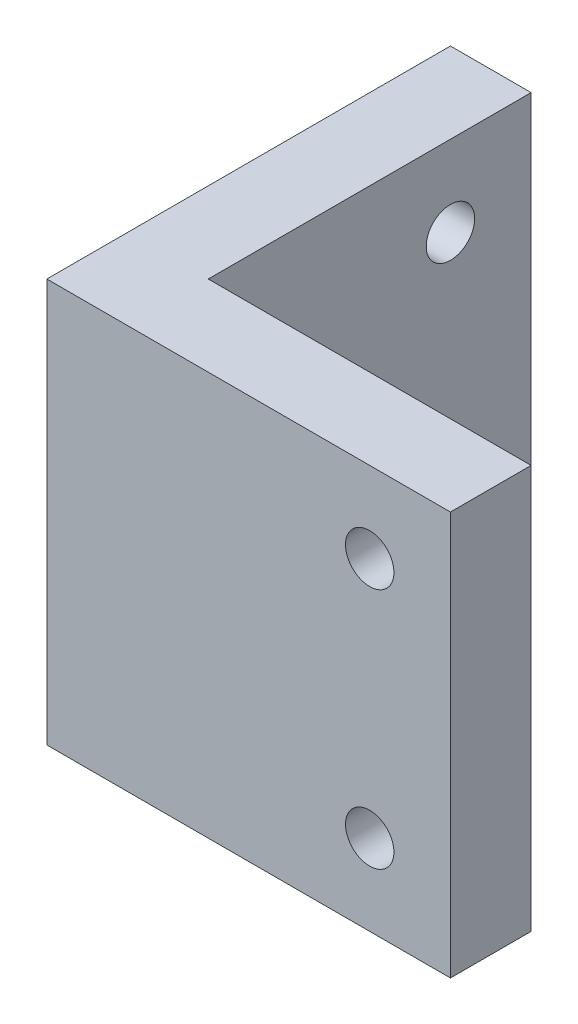
ISO-10303-21;
HEADER;
FILE_DESCRIPTION(('STEP AP214'),'2;1');
FILE_NAME('part.step','',(''),(''),'','','');
FILE_SCHEMA(('AUTOMOTIVE_DESIGN { 1 0 10303 214 1 1 1 1 }'));
ENDSEC;
DATA;
#1=APPLICATION_CONTEXT('core data for automotive mechanical design processes');
#2=APPLICATION_PROTOCOL_DEFINITION('international standard','automotive_design',2000,#1);
#3=PRODUCT_CONTEXT('',#1,'mechanical');
#4=PRODUCT('Part','Part','',(#3));
#5=PRODUCT_RELATED_PRODUCT_CATEGORY('part','',(#4));
#6=PRODUCT_DEFINITION_FORMATION('','',#4);
#7=PRODUCT_DEFINITION_CONTEXT('part definition',#1,'design');
#8=PRODUCT_DEFINITION('design','',#6,#7);
#9=PRODUCT_DEFINITION_SHAPE('','',#8);
#10=(LENGTH_UNIT() NAMED_UNIT(*) SI_UNIT(.MILLI.,.METRE.));
#11=(NAMED_UNIT(*) PLANE_ANGLE_UNIT() SI_UNIT($,.RADIAN.));
#12=(NAMED_UNIT(*) SI_UNIT($,.STERADIAN.) SOLID_ANGLE_UNIT());
#13=UNCERTAINTY_MEASURE_WITH_UNIT(LENGTH_MEASURE(1.E-05),#10,'distance_accuracy_value','');
#14=(GEOMETRIC_REPRESENTATION_CONTEXT(3) GLOBAL_UNCERTAINTY_ASSIGNED_CONTEXT((#13)) GLOBAL_UNIT_ASSIGNED_CONTEXT((#10,
#11,#12)) REPRESENTATION_CONTEXT('',''));
#15=CARTESIAN_POINT('',(0.,0.,0.));
#16=DIRECTION('',(0.,0.,1.));
#17=DIRECTION('',(1.,0.,0.));
#18=AXIS2_PLACEMENT_3D('',#15,#16,#17);
#19=CARTESIAN_POINT('',(25.,25.,-5.));
#20=DIRECTION('',(0.,0.,1.));
#21=DIRECTION('',(1.,0.,0.));
#22=AXIS2_PLACEMENT_3D('',#19,#20,#21);
#23=PLANE('',#22);
#24=CARTESIAN_POINT('',(20.,20.,-5.));
#25=DIRECTION('',(0.,0.,-1.));
#26=DIRECTION('',(-1.,0.,0.));
#27=AXIS2_PLACEMENT_3D('',#24,#25,#26);
#28=CIRCLE('',#27,1.5);
#29=CARTESIAN_POINT('',(18.5,20.,-5.));
#30=VERTEX_POINT('',#29);
#31=EDGE_CURVE('E138',#30,#30,#28,.T.);
#32=ORIENTED_EDGE('',*,*,#31,.F.);
#33=EDGE_LOOP('',(#32));
#34=FACE_BOUND('',#33,.T.);
#35=CARTESIAN_POINT('',(20.,5.,-5.));
#36=DIRECTION('',(0.,0.,-1.));
#37=DIRECTION('',(-1.,0.,0.));
#38=AXIS2_PLACEMENT_3D('',#35,#36,#37);
#39=CIRCLE('',#38,1.5);
#40=CARTESIAN_POINT('',(18.5,5.,-5.));
#41=VERTEX_POINT('',#40);
#42=EDGE_CURVE('E146',#41,#41,#39,.T.);
#43=ORIENTED_EDGE('',*,*,#42,.F.);
#44=EDGE_LOOP('',(#43));
#45=FACE_BOUND('',#44,.T.);
#46=DIRECTION('',(-1.,0.,0.));
#47=VECTOR('',#46,1.);
#48=CARTESIAN_POINT('',(25.,0.,-5.));
#49=LINE('',#48,#47);
#50=CARTESIAN_POINT('',(25.,0.,-5.));
#51=VERTEX_POINT('',#50);
#52=CARTESIAN_POINT('',(5.,0.,-4.99999999999999));
#53=VERTEX_POINT('',#52);
#54=EDGE_CURVE('E118',#51,#53,#49,.T.);
#55=ORIENTED_EDGE('',*,*,#54,.T.);
#56=DIRECTION('',(0.,-1.,0.));
#57=VECTOR('',#56,1.);
#58=CARTESIAN_POINT('',(5.,25.,-4.99999999999999));
#59=LINE('',#58,#57);
#60=CARTESIAN_POINT('',(5.,25.,-4.99999999999999));
#61=VERTEX_POINT('',#60);
#62=EDGE_CURVE('E11',#61,#53,#59,.T.);
#63=ORIENTED_EDGE('',*,*,#62,.F.);
#64=DIRECTION('',(-1.,0.,0.));
#65=VECTOR('',#64,1.);
#66=CARTESIAN_POINT('',(25.,25.,-5.));
#67=LINE('',#66,#65);
#68=CARTESIAN_POINT('',(25.,25.,-5.));
#69=VERTEX_POINT('',#68);
#70=EDGE_CURVE('E129',#69,#61,#67,.T.);
#71=ORIENTED_EDGE('',*,*,#70,.F.);
#72=DIRECTION('',(0.,-1.,0.));
#73=VECTOR('',#72,1.);
#74=CARTESIAN_POINT('',(25.,25.,-5.));
#75=LINE('',#74,#73);
#76=EDGE_CURVE('E114',#69,#51,#75,.T.);
#77=ORIENTED_EDGE('',*,*,#76,.T.);
#78=EDGE_LOOP('',(#55,#63,#71,#77));
#79=FACE_BOUND('',#78,.T.);
#80=ADVANCED_FACE('F32',(#34,#45,#79),#23,.F.);
#81=CARTESIAN_POINT('',(5.,25.,-4.99999999999999));
#82=DIRECTION('',(-1.,0.,0.));
#83=DIRECTION('',(0.,0.,1.));
#84=AXIS2_PLACEMENT_3D('',#81,#82,#83);
#85=PLANE('',#84);
#86=CARTESIAN_POINT('',(5.,20.,-20.));
#87=DIRECTION('',(1.,0.,0.));
#88=DIRECTION('',(0.,0.,-1.));
#89=AXIS2_PLACEMENT_3D('',#86,#87,#88);
#90=CIRCLE('',#89,1.5);
#91=CARTESIAN_POINT('',(5.,20.,-21.5));
#92=VERTEX_POINT('',#91);
#93=EDGE_CURVE('E142',#92,#92,#90,.T.);
#94=ORIENTED_EDGE('',*,*,#93,.F.);
#95=EDGE_LOOP('',(#94));
#96=FACE_BOUND('',#95,.T.);
#97=CARTESIAN_POINT('',(5.,5.07025328156771,-20.));
#98=DIRECTION('',(1.,0.,0.));
#99=DIRECTION('',(0.,0.,-1.));
#100=AXIS2_PLACEMENT_3D('',#97,#98,#99);
#101=CIRCLE('',#100,1.5);
#102=CARTESIAN_POINT('',(5.,5.07025328156771,-21.5));
#103=VERTEX_POINT('',#102);
#104=EDGE_CURVE('E148',#103,#103,#101,.T.);
#105=ORIENTED_EDGE('',*,*,#104,.F.);
#106=EDGE_LOOP('',(#105));
#107=FACE_BOUND('',#106,.T.);
#108=DIRECTION('',(0.,0.,-1.));
#109=VECTOR('',#108,1.);
#110=CARTESIAN_POINT('',(5.,0.,-4.99999999999999));
#111=LINE('',#110,#109);
#112=CARTESIAN_POINT('',(5.,0.,-25.));
#113=VERTEX_POINT('',#112);
#114=EDGE_CURVE('E121',#53,#113,#111,.T.);
#115=ORIENTED_EDGE('',*,*,#114,.T.);
#116=DIRECTION('',(0.,-1.,0.));
#117=VECTOR('',#116,1.);
#118=CARTESIAN_POINT('',(5.,25.,-25.));
#119=LINE('',#118,#117);
#120=CARTESIAN_POINT('',(5.,25.,-25.));
#121=VERTEX_POINT('',#120);
#122=EDGE_CURVE('E41',#121,#113,#119,.T.);
#123=ORIENTED_EDGE('',*,*,#122,.F.);
#124=DIRECTION('',(0.,0.,-1.));
#125=VECTOR('',#124,1.);
#126=CARTESIAN_POINT('',(5.,25.,-4.99999999999999));
#127=LINE('',#126,#125);
#128=EDGE_CURVE('E87',#61,#121,#127,.T.);
#129=ORIENTED_EDGE('',*,*,#128,.F.);
#130=ORIENTED_EDGE('',*,*,#62,.T.);
#131=EDGE_LOOP('',(#115,#123,#129,#130));
#132=FACE_BOUND('',#131,.T.);
#133=ADVANCED_FACE('F162',(#96,#107,#132),#85,.F.);
#134=CARTESIAN_POINT('',(5.,25.,-25.));
#135=DIRECTION('',(0.,0.,1.));
#136=DIRECTION('',(1.,0.,0.));
#137=AXIS2_PLACEMENT_3D('',#134,#135,#136);
#138=PLANE('',#137);
#139=DIRECTION('',(-1.,0.,0.));
#140=VECTOR('',#139,1.);
#141=CARTESIAN_POINT('',(5.,0.,-25.));
#142=LINE('',#141,#140);
#143=CARTESIAN_POINT('',(0.,0.,-25.));
#144=VERTEX_POINT('',#143);
#145=EDGE_CURVE('E124',#113,#144,#142,.T.);
#146=ORIENTED_EDGE('',*,*,#145,.T.);
#147=DIRECTION('',(0.,-1.,0.));
#148=VECTOR('',#147,1.);
#149=CARTESIAN_POINT('',(0.,25.,-25.));
#150=LINE('',#149,#148);
#151=CARTESIAN_POINT('',(0.,25.,-25.));
#152=VERTEX_POINT('',#151);
#153=EDGE_CURVE('E109',#152,#144,#150,.T.);
#154=ORIENTED_EDGE('',*,*,#153,.F.);
#155=DIRECTION('',(-1.,0.,0.));
#156=VECTOR('',#155,1.);
#157=CARTESIAN_POINT('',(5.,25.,-25.));
#158=LINE('',#157,#156);
#159=EDGE_CURVE('E100',#121,#152,#158,.T.);
#160=ORIENTED_EDGE('',*,*,#159,.F.);
#161=ORIENTED_EDGE('',*,*,#122,.T.);
#162=EDGE_LOOP('',(#146,#154,#160,#161));
#163=FACE_BOUND('',#162,.T.);
#164=ADVANCED_FACE('F165',(#163),#138,.F.);
#165=CARTESIAN_POINT('',(0.,25.,-25.));
#166=DIRECTION('',(1.,0.,0.));
#167=DIRECTION('',(0.,0.,-1.));
#168=AXIS2_PLACEMENT_3D('',#165,#166,#167);
#169=PLANE('',#168);
#170=CARTESIAN_POINT('',(0.,20.,-20.));
#171=DIRECTION('',(1.,0.,0.));
#172=DIRECTION('',(0.,0.,-1.));
#173=AXIS2_PLACEMENT_3D('',#170,#171,#172);
#174=CIRCLE('',#173,1.5);
#175=CARTESIAN_POINT('',(0.,20.,-21.5));
#176=VERTEX_POINT('',#175);
#177=EDGE_CURVE('E35',#176,#176,#174,.T.);
#178=ORIENTED_EDGE('',*,*,#177,.T.);
#179=EDGE_LOOP('',(#178));
#180=FACE_BOUND('',#179,.T.);
#181=CARTESIAN_POINT('',(0.,5.07025328156771,-20.));
#182=DIRECTION('',(1.,0.,0.));
#183=DIRECTION('',(0.,0.,-1.));
#184=AXIS2_PLACEMENT_3D('',#181,#182,#183);
#185=CIRCLE('',#184,1.5);
#186=CARTESIAN_POINT('',(0.,5.07025328156771,-21.5));
#187=VERTEX_POINT('',#186);
#188=EDGE_CURVE('E140',#187,#187,#185,.T.);
#189=ORIENTED_EDGE('',*,*,#188,.T.);
#190=EDGE_LOOP('',(#189));
#191=FACE_BOUND('',#190,.T.);
#192=DIRECTION('',(0.,0.,1.));
#193=VECTOR('',#192,1.);
#194=CARTESIAN_POINT('',(0.,0.,-25.));
#195=LINE('',#194,#193);
#196=CARTESIAN_POINT('',(0.,0.,0.));
#197=VERTEX_POINT('',#196);
#198=EDGE_CURVE('E108',#144,#197,#195,.T.);
#199=ORIENTED_EDGE('',*,*,#198,.T.);
#200=DIRECTION('',(0.,-1.,0.));
#201=VECTOR('',#200,1.);
#202=CARTESIAN_POINT('',(0.,25.,0.));
#203=LINE('',#202,#201);
#204=CARTESIAN_POINT('',(0.,25.,0.));
#205=VERTEX_POINT('',#204);
#206=EDGE_CURVE('E105',#205,#197,#203,.T.);
#207=ORIENTED_EDGE('',*,*,#206,.F.);
#208=DIRECTION('',(0.,0.,1.));
#209=VECTOR('',#208,1.);
#210=CARTESIAN_POINT('',(0.,25.,-25.));
#211=LINE('',#210,#209);
#212=EDGE_CURVE('E94',#152,#205,#211,.T.);
#213=ORIENTED_EDGE('',*,*,#212,.F.);
#214=ORIENTED_EDGE('',*,*,#153,.T.);
#215=EDGE_LOOP('',(#199,#207,#213,#214));
#216=FACE_BOUND('',#215,.T.);
#217=ADVANCED_FACE('F106',(#180,#191,#216),#169,.F.);
#218=CARTESIAN_POINT('',(0.,25.,0.));
#219=DIRECTION('',(0.,0.,-1.));
#220=DIRECTION('',(-1.,0.,0.));
#221=AXIS2_PLACEMENT_3D('',#218,#219,#220);
#222=PLANE('',#221);
#223=CARTESIAN_POINT('',(20.,20.,0.));
#224=DIRECTION('',(0.,0.,-1.));
#225=DIRECTION('',(-1.,0.,0.));
#226=AXIS2_PLACEMENT_3D('',#223,#224,#225);
#227=CIRCLE('',#226,1.5);
#228=CARTESIAN_POINT('',(18.5,20.,0.));
#229=VERTEX_POINT('',#228);
#230=EDGE_CURVE('E122',#229,#229,#227,.T.);
#231=ORIENTED_EDGE('',*,*,#230,.T.);
#232=EDGE_LOOP('',(#231));
#233=FACE_BOUND('',#232,.T.);
#234=CARTESIAN_POINT('',(20.,5.,0.));
#235=DIRECTION('',(0.,0.,-1.));
#236=DIRECTION('',(-1.,0.,0.));
#237=AXIS2_PLACEMENT_3D('',#234,#235,#236);
#238=CIRCLE('',#237,1.5);
#239=CARTESIAN_POINT('',(18.5,5.,0.));
#240=VERTEX_POINT('',#239);
#241=EDGE_CURVE('E135',#240,#240,#238,.T.);
#242=ORIENTED_EDGE('',*,*,#241,.T.);
#243=EDGE_LOOP('',(#242));
#244=FACE_BOUND('',#243,.T.);
#245=DIRECTION('',(1.,0.,0.));
#246=VECTOR('',#245,1.);
#247=CARTESIAN_POINT('',(0.,0.,0.));
#248=LINE('',#247,#246);
#249=CARTESIAN_POINT('',(25.,0.,0.));
#250=VERTEX_POINT('',#249);
#251=EDGE_CURVE('E73',#197,#250,#248,.T.);
#252=ORIENTED_EDGE('',*,*,#251,.T.);
#253=DIRECTION('',(0.,-1.,0.));
#254=VECTOR('',#253,1.);
#255=CARTESIAN_POINT('',(25.,25.,0.));
#256=LINE('',#255,#254);
#257=CARTESIAN_POINT('',(25.,25.,0.));
#258=VERTEX_POINT('',#257);
#259=EDGE_CURVE('E110',#258,#250,#256,.T.);
#260=ORIENTED_EDGE('',*,*,#259,.F.);
#261=DIRECTION('',(1.,0.,0.));
#262=VECTOR('',#261,1.);
#263=CARTESIAN_POINT('',(0.,25.,0.));
#264=LINE('',#263,#262);
#265=EDGE_CURVE('E98',#205,#258,#264,.T.);
#266=ORIENTED_EDGE('',*,*,#265,.F.);
#267=ORIENTED_EDGE('',*,*,#206,.T.);
#268=EDGE_LOOP('',(#252,#260,#266,#267));
#269=FACE_BOUND('',#268,.T.);
#270=ADVANCED_FACE('F112',(#233,#244,#269),#222,.F.);
#271=CARTESIAN_POINT('',(25.,25.,0.));
#272=DIRECTION('',(-1.,0.,0.));
#273=DIRECTION('',(0.,0.,1.));
#274=AXIS2_PLACEMENT_3D('',#271,#272,#273);
#275=PLANE('',#274);
#276=DIRECTION('',(0.,0.,-1.));
#277=VECTOR('',#276,1.);
#278=CARTESIAN_POINT('',(25.,0.,0.));
#279=LINE('',#278,#277);
#280=EDGE_CURVE('E79',#250,#51,#279,.T.);
#281=ORIENTED_EDGE('',*,*,#280,.T.);
#282=ORIENTED_EDGE('',*,*,#76,.F.);
#283=DIRECTION('',(0.,0.,-1.));
#284=VECTOR('',#283,1.);
#285=CARTESIAN_POINT('',(25.,25.,0.));
#286=LINE('',#285,#284);
#287=EDGE_CURVE('E50',#258,#69,#286,.T.);
#288=ORIENTED_EDGE('',*,*,#287,.F.);
#289=ORIENTED_EDGE('',*,*,#259,.T.);
#290=EDGE_LOOP('',(#281,#282,#288,#289));
#291=FACE_BOUND('',#290,.T.);
#292=ADVANCED_FACE('F170',(#291),#275,.F.);
#293=CARTESIAN_POINT('',(0.,25.,0.));
#294=DIRECTION('',(0.,-1.,0.));
#295=DIRECTION('',(0.,0.,-1.));
#296=AXIS2_PLACEMENT_3D('',#293,#294,#295);
#297=PLANE('',#296);
#298=ORIENTED_EDGE('',*,*,#70,.T.);
#299=ORIENTED_EDGE('',*,*,#128,.T.);
#300=ORIENTED_EDGE('',*,*,#159,.T.);
#301=ORIENTED_EDGE('',*,*,#212,.T.);
#302=ORIENTED_EDGE('',*,*,#265,.T.);
#303=ORIENTED_EDGE('',*,*,#287,.T.);
#304=EDGE_LOOP('',(#298,#299,#300,#301,#302,#303));
#305=FACE_BOUND('',#304,.T.);
#306=ADVANCED_FACE('F96',(#305),#297,.F.);
#307=CARTESIAN_POINT('',(0.,0.,0.));
#308=DIRECTION('',(0.,-1.,0.));
#309=DIRECTION('',(0.,0.,-1.));
#310=AXIS2_PLACEMENT_3D('',#307,#308,#309);
#311=PLANE('',#310);
#312=ORIENTED_EDGE('',*,*,#54,.F.);
#313=ORIENTED_EDGE('',*,*,#280,.F.);
#314=ORIENTED_EDGE('',*,*,#251,.F.);
#315=ORIENTED_EDGE('',*,*,#198,.F.);
#316=ORIENTED_EDGE('',*,*,#145,.F.);
#317=ORIENTED_EDGE('',*,*,#114,.F.);
#318=EDGE_LOOP('',(#312,#313,#314,#315,#316,#317));
#319=FACE_BOUND('',#318,.T.);
#320=ADVANCED_FACE('F168',(#319),#311,.T.);
#321=CARTESIAN_POINT('',(20.,5.,5.));
#322=DIRECTION('',(0.,0.,-1.));
#323=DIRECTION('',(-1.,0.,0.));
#324=AXIS2_PLACEMENT_3D('',#321,#322,#323);
#325=CYLINDRICAL_SURFACE('',#324,1.5);
#326=ORIENTED_EDGE('',*,*,#42,.T.);
#327=EDGE_LOOP('',(#326));
#328=FACE_BOUND('',#327,.T.);
#329=ORIENTED_EDGE('',*,*,#241,.F.);
#330=EDGE_LOOP('',(#329));
#331=FACE_BOUND('',#330,.T.);
#332=ADVANCED_FACE('F193',(#328,#331),#325,.F.);
#333=CARTESIAN_POINT('',(20.,20.,5.));
#334=DIRECTION('',(0.,0.,-1.));
#335=DIRECTION('',(-1.,0.,0.));
#336=AXIS2_PLACEMENT_3D('',#333,#334,#335);
#337=CYLINDRICAL_SURFACE('',#336,1.5);
#338=ORIENTED_EDGE('',*,*,#31,.T.);
#339=EDGE_LOOP('',(#338));
#340=FACE_BOUND('',#339,.T.);
#341=ORIENTED_EDGE('',*,*,#230,.F.);
#342=EDGE_LOOP('',(#341));
#343=FACE_BOUND('',#342,.T.);
#344=ADVANCED_FACE('F196',(#340,#343),#337,.F.);
#345=CARTESIAN_POINT('',(-5.,5.07025328156771,-20.));
#346=DIRECTION('',(1.,0.,0.));
#347=DIRECTION('',(0.,0.,-1.));
#348=AXIS2_PLACEMENT_3D('',#345,#346,#347);
#349=CYLINDRICAL_SURFACE('',#348,1.5);
#350=ORIENTED_EDGE('',*,*,#104,.T.);
#351=EDGE_LOOP('',(#350));
#352=FACE_BOUND('',#351,.T.);
#353=ORIENTED_EDGE('',*,*,#188,.F.);
#354=EDGE_LOOP('',(#353));
#355=FACE_BOUND('',#354,.T.);
#356=ADVANCED_FACE('F204',(#352,#355),#349,.F.);
#357=CARTESIAN_POINT('',(-5.,20.,-20.));
#358=DIRECTION('',(1.,0.,0.));
#359=DIRECTION('',(0.,0.,-1.));
#360=AXIS2_PLACEMENT_3D('',#357,#358,#359);
#361=CYLINDRICAL_SURFACE('',#360,1.5);
#362=ORIENTED_EDGE('',*,*,#93,.T.);
#363=EDGE_LOOP('',(#362));
#364=FACE_BOUND('',#363,.T.);
#365=ORIENTED_EDGE('',*,*,#177,.F.);
#366=EDGE_LOOP('',(#365));
#367=FACE_BOUND('',#366,.T.);
#368=ADVANCED_FACE('F210',(#364,#367),#361,.F.);
#369=CLOSED_SHELL('',(#80,#133,#164,#217,#270,#292,#306,#320,#332,#344,#356,#368));
#370=MANIFOLD_SOLID_BREP('B2',#369);
#371=ADVANCED_BREP_SHAPE_REPRESENTATION('',(#18,#370),#14);
#372=SHAPE_DEFINITION_REPRESENTATION(#9,#371);
ENDSEC;
END-ISO-10303-21;
